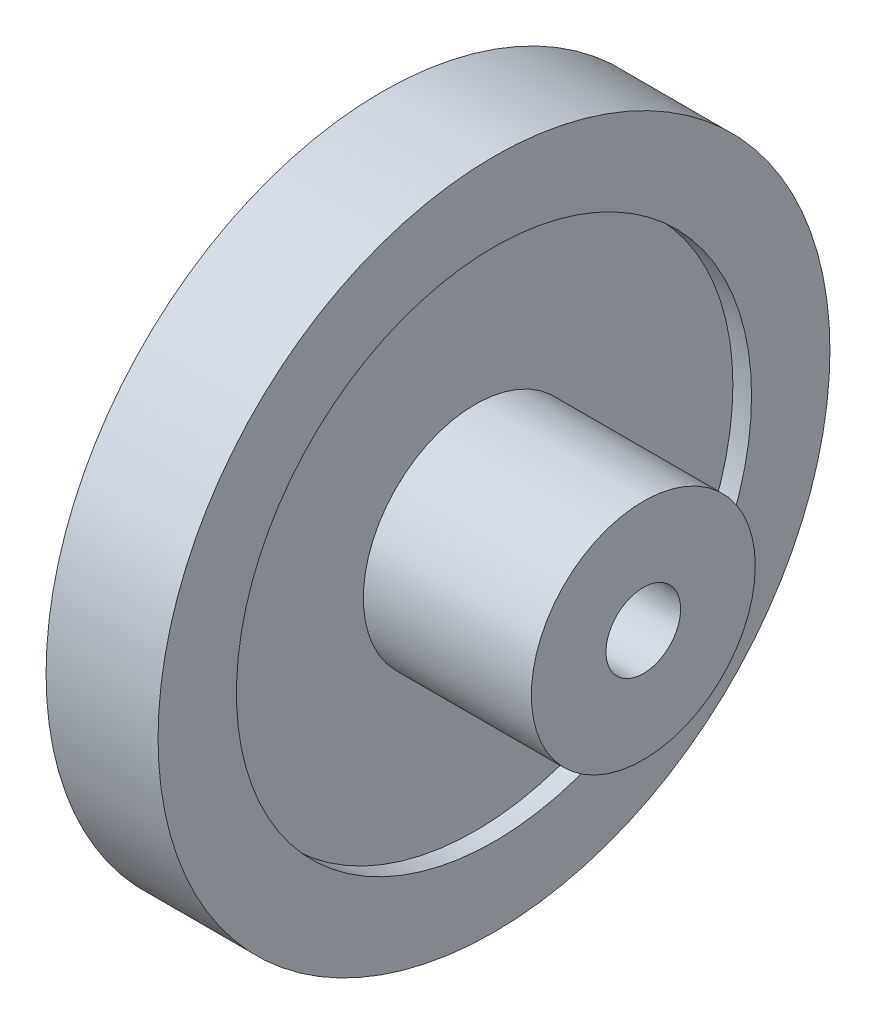
ISO-10303-21;
HEADER;
FILE_DESCRIPTION(('STEP AP214'),'2;1');
FILE_NAME('part.step','',(''),(''),'','','');
FILE_SCHEMA(('AUTOMOTIVE_DESIGN { 1 0 10303 214 1 1 1 1 }'));
ENDSEC;
DATA;
#1=APPLICATION_CONTEXT('core data for automotive mechanical design processes');
#2=APPLICATION_PROTOCOL_DEFINITION('international standard','automotive_design',2000,#1);
#3=PRODUCT_CONTEXT('',#1,'mechanical');
#4=PRODUCT('Part','Part','',(#3));
#5=PRODUCT_RELATED_PRODUCT_CATEGORY('part','',(#4));
#6=PRODUCT_DEFINITION_FORMATION('','',#4);
#7=PRODUCT_DEFINITION_CONTEXT('part definition',#1,'design');
#8=PRODUCT_DEFINITION('design','',#6,#7);
#9=PRODUCT_DEFINITION_SHAPE('','',#8);
#10=(LENGTH_UNIT() NAMED_UNIT(*) SI_UNIT(.MILLI.,.METRE.));
#11=(NAMED_UNIT(*) PLANE_ANGLE_UNIT() SI_UNIT($,.RADIAN.));
#12=(NAMED_UNIT(*) SI_UNIT($,.STERADIAN.) SOLID_ANGLE_UNIT());
#13=UNCERTAINTY_MEASURE_WITH_UNIT(LENGTH_MEASURE(1.E-05),#10,'distance_accuracy_value','');
#14=(GEOMETRIC_REPRESENTATION_CONTEXT(3) GLOBAL_UNCERTAINTY_ASSIGNED_CONTEXT((#13)) GLOBAL_UNIT_ASSIGNED_CONTEXT((#10,
#11,#12)) REPRESENTATION_CONTEXT('',''));
#15=CARTESIAN_POINT('',(0.,0.,0.));
#16=DIRECTION('',(0.,0.,1.));
#17=DIRECTION('',(1.,0.,0.));
#18=AXIS2_PLACEMENT_3D('',#15,#16,#17);
#19=CARTESIAN_POINT('',(2.5,0.,0.));
#20=DIRECTION('',(1.,0.,0.));
#21=DIRECTION('',(0.,0.,-1.));
#22=AXIS2_PLACEMENT_3D('',#19,#20,#21);
#23=PLANE('',#22);
#24=CARTESIAN_POINT('',(2.5,-1.73477898712804E-12,-3.90798504668055E-13));
#25=DIRECTION('',(1.,0.,0.));
#26=DIRECTION('',(0.,0.,-1.));
#27=AXIS2_PLACEMENT_3D('',#24,#25,#26);
#28=CIRCLE('',#27,2.99999999999843);
#29=CARTESIAN_POINT('',(2.5,-1.73477898712804E-12,-2.99999999999883));
#30=VERTEX_POINT('',#29);
#31=EDGE_CURVE('E57',#30,#30,#28,.T.);
#32=ORIENTED_EDGE('',*,*,#31,.F.);
#33=EDGE_LOOP('',(#32));
#34=FACE_BOUND('',#33,.T.);
#35=CARTESIAN_POINT('',(2.5,0.,0.));
#36=DIRECTION('',(1.,0.,0.));
#37=DIRECTION('',(0.,0.,-1.));
#38=AXIS2_PLACEMENT_3D('',#35,#36,#37);
#39=CIRCLE('',#38,6.9);
#40=CARTESIAN_POINT('',(2.5,0.,-6.9));
#41=VERTEX_POINT('',#40);
#42=EDGE_CURVE('E50',#41,#41,#39,.T.);
#43=ORIENTED_EDGE('',*,*,#42,.T.);
#44=EDGE_LOOP('',(#43));
#45=FACE_BOUND('',#44,.T.);
#46=ADVANCED_FACE('F35',(#34,#45),#23,.T.);
#47=CARTESIAN_POINT('',(3.,0.,0.));
#48=DIRECTION('',(-1.,0.,0.));
#49=DIRECTION('',(0.,0.,1.));
#50=AXIS2_PLACEMENT_3D('',#47,#48,#49);
#51=CYLINDRICAL_SURFACE('',#50,1.);
#52=CARTESIAN_POINT('',(7.,-1.73477898712804E-12,-3.90798504668055E-13));
#53=DIRECTION('',(1.,0.,0.));
#54=DIRECTION('',(0.,0.,-1.));
#55=AXIS2_PLACEMENT_3D('',#52,#53,#54);
#56=CIRCLE('',#55,0.999999999998498);
#57=CARTESIAN_POINT('',(7.,-1.73477898712804E-12,-0.999999999998889));
#58=VERTEX_POINT('',#57);
#59=EDGE_CURVE('E60',#58,#58,#56,.T.);
#60=ORIENTED_EDGE('',*,*,#59,.T.);
#61=EDGE_LOOP('',(#60));
#62=FACE_BOUND('',#61,.T.);
#63=CARTESIAN_POINT('',(0.,0.,0.));
#64=DIRECTION('',(1.,0.,0.));
#65=DIRECTION('',(0.,0.,-1.));
#66=AXIS2_PLACEMENT_3D('',#63,#64,#65);
#67=CIRCLE('',#66,1.);
#68=CARTESIAN_POINT('',(0.,0.,-1.00000000000001));
#69=VERTEX_POINT('',#68);
#70=EDGE_CURVE('E46',#69,#69,#67,.T.);
#71=ORIENTED_EDGE('',*,*,#70,.F.);
#72=EDGE_LOOP('',(#71));
#73=FACE_BOUND('',#72,.T.);
#74=ADVANCED_FACE('F66',(#62,#73),#51,.F.);
#75=CARTESIAN_POINT('',(3.,0.129972733663192,-8.50768071599674));
#76=DIRECTION('',(-1.,0.,0.));
#77=DIRECTION('',(0.,0.,1.));
#78=AXIS2_PLACEMENT_3D('',#75,#76,#77);
#79=PLANE('',#78);
#80=CARTESIAN_POINT('',(3.,0.,0.));
#81=DIRECTION('',(1.,0.,0.));
#82=DIRECTION('',(0.,0.,-1.));
#83=AXIS2_PLACEMENT_3D('',#80,#81,#82);
#84=CIRCLE('',#83,9.);
#85=CARTESIAN_POINT('',(3.,0.,-9.00000000000001));
#86=VERTEX_POINT('',#85);
#87=EDGE_CURVE('E10',#86,#86,#84,.T.);
#88=ORIENTED_EDGE('',*,*,#87,.T.);
#89=EDGE_LOOP('',(#88));
#90=FACE_BOUND('',#89,.T.);
#91=CARTESIAN_POINT('',(3.,0.,0.));
#92=DIRECTION('',(1.,0.,0.));
#93=DIRECTION('',(0.,0.,-1.));
#94=AXIS2_PLACEMENT_3D('',#91,#92,#93);
#95=CIRCLE('',#94,6.9);
#96=CARTESIAN_POINT('',(3.,0.,-6.9));
#97=VERTEX_POINT('',#96);
#98=EDGE_CURVE('E51',#97,#97,#95,.T.);
#99=ORIENTED_EDGE('',*,*,#98,.F.);
#100=EDGE_LOOP('',(#99));
#101=FACE_BOUND('',#100,.T.);
#102=ADVANCED_FACE('F89',(#90,#101),#79,.F.);
#103=CARTESIAN_POINT('',(0.,0.129972733663192,-8.50768071599674));
#104=DIRECTION('',(-1.,0.,0.));
#105=DIRECTION('',(0.,0.,1.));
#106=AXIS2_PLACEMENT_3D('',#103,#104,#105);
#107=PLANE('',#106);
#108=CARTESIAN_POINT('',(0.,0.,0.));
#109=DIRECTION('',(1.,0.,0.));
#110=DIRECTION('',(0.,0.,-1.));
#111=AXIS2_PLACEMENT_3D('',#108,#109,#110);
#112=CIRCLE('',#111,8.99999999999999);
#113=CARTESIAN_POINT('',(0.,0.,-8.99999999999999));
#114=VERTEX_POINT('',#113);
#115=EDGE_CURVE('E39',#114,#114,#112,.T.);
#116=ORIENTED_EDGE('',*,*,#115,.F.);
#117=EDGE_LOOP('',(#116));
#118=FACE_BOUND('',#117,.T.);
#119=ORIENTED_EDGE('',*,*,#70,.T.);
#120=EDGE_LOOP('',(#119));
#121=FACE_BOUND('',#120,.T.);
#122=ADVANCED_FACE('F95',(#118,#121),#107,.T.);
#123=CARTESIAN_POINT('',(3.,0.,0.));
#124=DIRECTION('',(-1.,0.,0.));
#125=DIRECTION('',(0.,0.,1.));
#126=AXIS2_PLACEMENT_3D('',#123,#124,#125);
#127=CYLINDRICAL_SURFACE('',#126,8.99999999999999);
#128=ORIENTED_EDGE('',*,*,#115,.T.);
#129=EDGE_LOOP('',(#128));
#130=FACE_BOUND('',#129,.T.);
#131=ORIENTED_EDGE('',*,*,#87,.F.);
#132=EDGE_LOOP('',(#131));
#133=FACE_BOUND('',#132,.T.);
#134=ADVANCED_FACE('F37',(#130,#133),#127,.T.);
#135=CARTESIAN_POINT('',(2.5,0.,0.));
#136=DIRECTION('',(1.,0.,0.));
#137=DIRECTION('',(0.,0.,-1.));
#138=AXIS2_PLACEMENT_3D('',#135,#136,#137);
#139=CYLINDRICAL_SURFACE('',#138,6.9);
#140=ORIENTED_EDGE('',*,*,#42,.F.);
#141=EDGE_LOOP('',(#140));
#142=FACE_BOUND('',#141,.T.);
#143=ORIENTED_EDGE('',*,*,#98,.T.);
#144=EDGE_LOOP('',(#143));
#145=FACE_BOUND('',#144,.T.);
#146=ADVANCED_FACE('F72',(#142,#145),#139,.F.);
#147=CARTESIAN_POINT('',(7.,-0.00200455213729739,-2.08425656763246));
#148=DIRECTION('',(1.,0.,0.));
#149=DIRECTION('',(0.,0.,-1.));
#150=AXIS2_PLACEMENT_3D('',#147,#148,#149);
#151=PLANE('',#150);
#152=CARTESIAN_POINT('',(7.,-1.73477898712804E-12,-3.90798504668055E-13));
#153=DIRECTION('',(1.,0.,0.));
#154=DIRECTION('',(0.,0.,-1.));
#155=AXIS2_PLACEMENT_3D('',#152,#153,#154);
#156=CIRCLE('',#155,2.99999999999843);
#157=CARTESIAN_POINT('',(7.,-1.73477898712804E-12,-2.99999999999883));
#158=VERTEX_POINT('',#157);
#159=EDGE_CURVE('E54',#158,#158,#156,.T.);
#160=ORIENTED_EDGE('',*,*,#159,.T.);
#161=EDGE_LOOP('',(#160));
#162=FACE_BOUND('',#161,.T.);
#163=ORIENTED_EDGE('',*,*,#59,.F.);
#164=EDGE_LOOP('',(#163));
#165=FACE_BOUND('',#164,.T.);
#166=ADVANCED_FACE('F69',(#162,#165),#151,.T.);
#167=CARTESIAN_POINT('',(7.,-1.73477898712804E-12,-3.90798504668055E-13));
#168=DIRECTION('',(-1.,0.,0.));
#169=DIRECTION('',(0.,0.,1.));
#170=AXIS2_PLACEMENT_3D('',#167,#168,#169);
#171=CYLINDRICAL_SURFACE('',#170,2.99999999999843);
#172=ORIENTED_EDGE('',*,*,#31,.T.);
#173=EDGE_LOOP('',(#172));
#174=FACE_BOUND('',#173,.T.);
#175=ORIENTED_EDGE('',*,*,#159,.F.);
#176=EDGE_LOOP('',(#175));
#177=FACE_BOUND('',#176,.T.);
#178=ADVANCED_FACE('F71',(#174,#177),#171,.T.);
#179=CLOSED_SHELL('',(#46,#74,#102,#122,#134,#146,#166,#178));
#180=MANIFOLD_SOLID_BREP('B2',#179);
#181=ADVANCED_BREP_SHAPE_REPRESENTATION('',(#18,#180),#14);
#182=SHAPE_DEFINITION_REPRESENTATION(#9,#181);
ENDSEC;
END-ISO-10303-21;
